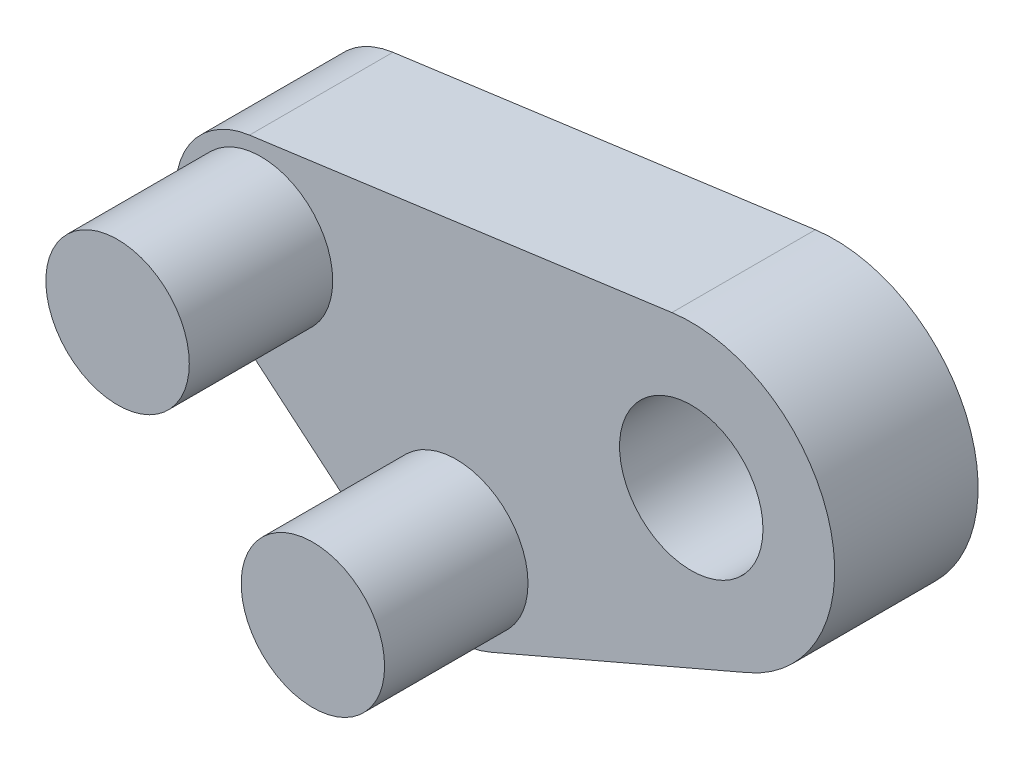
ISO-10303-21;
HEADER;
FILE_DESCRIPTION(('STEP AP214'),'2;1');
FILE_NAME('part.step','',(''),(''),'','','');
FILE_SCHEMA(('AUTOMOTIVE_DESIGN { 1 0 10303 214 1 1 1 1 }'));
ENDSEC;
DATA;
#1=APPLICATION_CONTEXT('core data for automotive mechanical design processes');
#2=APPLICATION_PROTOCOL_DEFINITION('international standard','automotive_design',2000,#1);
#3=PRODUCT_CONTEXT('',#1,'mechanical');
#4=PRODUCT('Part','Part','',(#3));
#5=PRODUCT_RELATED_PRODUCT_CATEGORY('part','',(#4));
#6=PRODUCT_DEFINITION_FORMATION('','',#4);
#7=PRODUCT_DEFINITION_CONTEXT('part definition',#1,'design');
#8=PRODUCT_DEFINITION('design','',#6,#7);
#9=PRODUCT_DEFINITION_SHAPE('','',#8);
#10=(LENGTH_UNIT() NAMED_UNIT(*) SI_UNIT(.MILLI.,.METRE.));
#11=(NAMED_UNIT(*) PLANE_ANGLE_UNIT() SI_UNIT($,.RADIAN.));
#12=(NAMED_UNIT(*) SI_UNIT($,.STERADIAN.) SOLID_ANGLE_UNIT());
#13=UNCERTAINTY_MEASURE_WITH_UNIT(LENGTH_MEASURE(1.E-05),#10,'distance_accuracy_value','');
#14=(GEOMETRIC_REPRESENTATION_CONTEXT(3) GLOBAL_UNCERTAINTY_ASSIGNED_CONTEXT((#13)) GLOBAL_UNIT_ASSIGNED_CONTEXT((#10,
#11,#12)) REPRESENTATION_CONTEXT('',''));
#15=CARTESIAN_POINT('',(0.,0.,0.));
#16=DIRECTION('',(0.,0.,1.));
#17=DIRECTION('',(1.,0.,0.));
#18=AXIS2_PLACEMENT_3D('',#15,#16,#17);
#19=CARTESIAN_POINT('',(0.,0.,-5.));
#20=DIRECTION('',(0.,0.,-1.));
#21=DIRECTION('',(0.,-1.,0.));
#22=AXIS2_PLACEMENT_3D('',#19,#20,#21);
#23=PLANE('',#22);
#24=CARTESIAN_POINT('',(0.,0.,-5.));
#25=DIRECTION('',(0.,0.,1.));
#26=DIRECTION('',(-1.,0.,0.));
#27=AXIS2_PLACEMENT_3D('',#24,#25,#26);
#28=CIRCLE('',#27,2.5);
#29=CARTESIAN_POINT('',(2.5,0.,-5.));
#30=VERTEX_POINT('',#29);
#31=EDGE_CURVE('E27',#30,#30,#28,.T.);
#32=ORIENTED_EDGE('',*,*,#31,.T.);
#33=EDGE_LOOP('',(#32));
#34=FACE_BOUND('',#33,.T.);
#35=DIRECTION('',(0.990857555188311,0.134912213406509,0.));
#36=VECTOR('',#35,1.);
#37=CARTESIAN_POINT('',(-15.4015414871389,2.94910598682629,-5.));
#38=LINE('',#37,#36);
#39=CARTESIAN_POINT('',(-15.4015414871389,2.94910598682629,-5.));
#40=VERTEX_POINT('',#39);
#41=CARTESIAN_POINT('',(-0.674561067032546,4.95428777594155,-5.));
#42=VERTEX_POINT('',#41);
#43=EDGE_CURVE('E134',#40,#42,#38,.T.);
#44=ORIENTED_EDGE('',*,*,#43,.T.);
#45=CARTESIAN_POINT('',(0.,0.,-5.));
#46=DIRECTION('',(0.,0.,-1.));
#47=DIRECTION('',(-0.395938420086769,0.918277064670132,0.));
#48=AXIS2_PLACEMENT_3D('',#45,#46,#47);
#49=CIRCLE('',#48,5.);
#50=CARTESIAN_POINT('',(1.97969210043384,-4.59138532335066,-5.));
#51=VERTEX_POINT('',#50);
#52=EDGE_CURVE('E198',#42,#51,#49,.T.);
#53=ORIENTED_EDGE('',*,*,#52,.T.);
#54=DIRECTION('',(-0.918277064670132,-0.395938420086768,0.));
#55=VECTOR('',#54,1.);
#56=CARTESIAN_POINT('',(1.97969210043384,-4.59138532335066,-5.));
#57=LINE('',#56,#55);
#58=CARTESIAN_POINT('',(-7.01308227185481,-8.46884781713493,-5.));
#59=VERTEX_POINT('',#58);
#60=EDGE_CURVE('E163',#51,#59,#57,.T.);
#61=ORIENTED_EDGE('',*,*,#60,.T.);
#62=CARTESIAN_POINT('',(-8.19152044288992,-5.73576436351047,-5.));
#63=DIRECTION('',(0.,0.,-1.));
#64=DIRECTION('',(0.644287412416517,0.764783453143195,0.));
#65=AXIS2_PLACEMENT_3D('',#62,#63,#64);
#66=CIRCLE('',#65,2.97631679890236);
#67=CARTESIAN_POINT('',(-10.1091238917865,-8.01200220262312,-5.));
#68=VERTEX_POINT('',#67);
#69=EDGE_CURVE('E172',#59,#68,#66,.T.);
#70=ORIENTED_EDGE('',*,*,#69,.T.);
#71=DIRECTION('',(-0.764783453143194,0.644287412416517,0.));
#72=VECTOR('',#71,1.);
#73=CARTESIAN_POINT('',(-10.1091238917865,-8.01200220262312,-5.));
#74=LINE('',#73,#72);
#75=CARTESIAN_POINT('',(-16.9176034488966,-2.27623783911265,-5.));
#76=VERTEX_POINT('',#75);
#77=EDGE_CURVE('E72',#68,#76,#74,.T.);
#78=ORIENTED_EDGE('',*,*,#77,.T.);
#79=CARTESIAN_POINT('',(-15.,0.,-5.));
#80=DIRECTION('',(0.,0.,-1.));
#81=DIRECTION('',(0.134912213406509,-0.990857555188311,0.));
#82=AXIS2_PLACEMENT_3D('',#79,#80,#81);
#83=CIRCLE('',#82,2.97631679890236);
#84=EDGE_CURVE('E148',#76,#40,#83,.T.);
#85=ORIENTED_EDGE('',*,*,#84,.T.);
#86=EDGE_LOOP('',(#44,#53,#61,#70,#78,#85));
#87=FACE_BOUND('',#86,.T.);
#88=ADVANCED_FACE('F16',(#34,#87),#23,.T.);
#89=CARTESIAN_POINT('',(0.,0.,0.));
#90=DIRECTION('',(0.,0.,-1.));
#91=DIRECTION('',(0.,-1.,0.));
#92=AXIS2_PLACEMENT_3D('',#89,#90,#91);
#93=PLANE('',#92);
#94=CARTESIAN_POINT('',(0.,0.,0.));
#95=DIRECTION('',(0.,0.,-1.));
#96=DIRECTION('',(-1.,0.,0.));
#97=AXIS2_PLACEMENT_3D('',#94,#95,#96);
#98=CIRCLE('',#97,2.5);
#99=CARTESIAN_POINT('',(2.5,0.,0.));
#100=VERTEX_POINT('',#99);
#101=EDGE_CURVE('E10',#100,#100,#98,.T.);
#102=ORIENTED_EDGE('',*,*,#101,.T.);
#103=EDGE_LOOP('',(#102));
#104=FACE_BOUND('',#103,.T.);
#105=CARTESIAN_POINT('',(-15.,0.,0.));
#106=DIRECTION('',(0.,0.,-1.));
#107=DIRECTION('',(-1.,0.,0.));
#108=AXIS2_PLACEMENT_3D('',#105,#106,#107);
#109=CIRCLE('',#108,2.5);
#110=CARTESIAN_POINT('',(-12.5,0.,0.));
#111=VERTEX_POINT('',#110);
#112=EDGE_CURVE('E183',#111,#111,#109,.T.);
#113=ORIENTED_EDGE('',*,*,#112,.T.);
#114=EDGE_LOOP('',(#113));
#115=FACE_BOUND('',#114,.T.);
#116=CARTESIAN_POINT('',(-8.19152044288992,-5.73576436351047,0.));
#117=DIRECTION('',(0.,0.,-1.));
#118=DIRECTION('',(-1.,0.,0.));
#119=AXIS2_PLACEMENT_3D('',#116,#117,#118);
#120=CIRCLE('',#119,2.5);
#121=CARTESIAN_POINT('',(-5.69152044288991,-5.73576436351047,0.));
#122=VERTEX_POINT('',#121);
#123=EDGE_CURVE('E107',#122,#122,#120,.T.);
#124=ORIENTED_EDGE('',*,*,#123,.T.);
#125=EDGE_LOOP('',(#124));
#126=FACE_BOUND('',#125,.T.);
#127=DIRECTION('',(-0.990857555188311,-0.134912213406509,0.));
#128=VECTOR('',#127,1.);
#129=CARTESIAN_POINT('',(-0.674561067032546,4.95428777594155,0.));
#130=LINE('',#129,#128);
#131=CARTESIAN_POINT('',(-0.674561067032546,4.95428777594155,0.));
#132=VERTEX_POINT('',#131);
#133=CARTESIAN_POINT('',(-15.4015414871389,2.94910598682629,0.));
#134=VERTEX_POINT('',#133);
#135=EDGE_CURVE('E123',#132,#134,#130,.T.);
#136=ORIENTED_EDGE('',*,*,#135,.T.);
#137=CARTESIAN_POINT('',(-15.,0.,0.));
#138=DIRECTION('',(0.,0.,1.));
#139=DIRECTION('',(0.134912213406509,-0.990857555188311,0.));
#140=AXIS2_PLACEMENT_3D('',#137,#138,#139);
#141=CIRCLE('',#140,2.97631679890236);
#142=CARTESIAN_POINT('',(-16.9176034488966,-2.27623783911265,0.));
#143=VERTEX_POINT('',#142);
#144=EDGE_CURVE('E20',#134,#143,#141,.T.);
#145=ORIENTED_EDGE('',*,*,#144,.T.);
#146=DIRECTION('',(0.764783453143194,-0.644287412416517,0.));
#147=VECTOR('',#146,1.);
#148=CARTESIAN_POINT('',(-16.9176034488966,-2.27623783911265,0.));
#149=LINE('',#148,#147);
#150=CARTESIAN_POINT('',(-10.1091238917865,-8.01200220262312,0.));
#151=VERTEX_POINT('',#150);
#152=EDGE_CURVE('E158',#143,#151,#149,.T.);
#153=ORIENTED_EDGE('',*,*,#152,.T.);
#154=CARTESIAN_POINT('',(-8.19152044288992,-5.73576436351047,0.));
#155=DIRECTION('',(0.,0.,1.));
#156=DIRECTION('',(0.644287412416517,0.764783453143195,0.));
#157=AXIS2_PLACEMENT_3D('',#154,#155,#156);
#158=CIRCLE('',#157,2.97631679890236);
#159=CARTESIAN_POINT('',(-7.01308227185481,-8.46884781713493,0.));
#160=VERTEX_POINT('',#159);
#161=EDGE_CURVE('E167',#151,#160,#158,.T.);
#162=ORIENTED_EDGE('',*,*,#161,.T.);
#163=DIRECTION('',(0.918277064670132,0.395938420086768,0.));
#164=VECTOR('',#163,1.);
#165=CARTESIAN_POINT('',(-7.01308227185481,-8.46884781713493,0.));
#166=LINE('',#165,#164);
#167=CARTESIAN_POINT('',(1.97969210043384,-4.59138532335066,0.));
#168=VERTEX_POINT('',#167);
#169=EDGE_CURVE('E84',#160,#168,#166,.T.);
#170=ORIENTED_EDGE('',*,*,#169,.T.);
#171=CARTESIAN_POINT('',(0.,0.,0.));
#172=DIRECTION('',(0.,0.,1.));
#173=DIRECTION('',(-0.395938420086769,0.918277064670132,0.));
#174=AXIS2_PLACEMENT_3D('',#171,#172,#173);
#175=CIRCLE('',#174,5.);
#176=EDGE_CURVE('E128',#168,#132,#175,.T.);
#177=ORIENTED_EDGE('',*,*,#176,.T.);
#178=EDGE_LOOP('',(#136,#145,#153,#162,#170,#177));
#179=FACE_BOUND('',#178,.T.);
#180=ADVANCED_FACE('F125',(#104,#115,#126,#179),#93,.F.);
#181=CARTESIAN_POINT('',(0.,0.,0.));
#182=DIRECTION('',(0.,0.,-1.));
#183=DIRECTION('',(-1.,0.,0.));
#184=AXIS2_PLACEMENT_3D('',#181,#182,#183);
#185=CYLINDRICAL_SURFACE('',#184,2.5);
#186=ORIENTED_EDGE('',*,*,#101,.F.);
#187=EDGE_LOOP('',(#186));
#188=FACE_BOUND('',#187,.T.);
#189=ORIENTED_EDGE('',*,*,#31,.F.);
#190=EDGE_LOOP('',(#189));
#191=FACE_BOUND('',#190,.T.);
#192=ADVANCED_FACE('F232',(#188,#191),#185,.F.);
#193=CARTESIAN_POINT('',(-15.,0.,5.));
#194=DIRECTION('',(0.,0.,-1.));
#195=DIRECTION('',(0.,-1.,0.));
#196=AXIS2_PLACEMENT_3D('',#193,#194,#195);
#197=PLANE('',#196);
#198=CARTESIAN_POINT('',(-15.,0.,5.));
#199=DIRECTION('',(0.,0.,-1.));
#200=DIRECTION('',(-1.,0.,0.));
#201=AXIS2_PLACEMENT_3D('',#198,#199,#200);
#202=CIRCLE('',#201,2.5);
#203=CARTESIAN_POINT('',(-12.5,0.,5.));
#204=VERTEX_POINT('',#203);
#205=EDGE_CURVE('E213',#204,#204,#202,.T.);
#206=ORIENTED_EDGE('',*,*,#205,.F.);
#207=EDGE_LOOP('',(#206));
#208=FACE_BOUND('',#207,.T.);
#209=ADVANCED_FACE('F18',(#208),#197,.F.);
#210=CARTESIAN_POINT('',(-15.,0.,0.));
#211=DIRECTION('',(0.,0.,1.));
#212=DIRECTION('',(-1.,0.,0.));
#213=AXIS2_PLACEMENT_3D('',#210,#211,#212);
#214=CYLINDRICAL_SURFACE('',#213,2.5);
#215=ORIENTED_EDGE('',*,*,#112,.F.);
#216=EDGE_LOOP('',(#215));
#217=FACE_BOUND('',#216,.T.);
#218=ORIENTED_EDGE('',*,*,#205,.T.);
#219=EDGE_LOOP('',(#218));
#220=FACE_BOUND('',#219,.T.);
#221=ADVANCED_FACE('F224',(#217,#220),#214,.T.);
#222=CARTESIAN_POINT('',(-8.19152044288992,-5.73576436351047,5.));
#223=DIRECTION('',(0.,0.,-1.));
#224=DIRECTION('',(0.,-1.,0.));
#225=AXIS2_PLACEMENT_3D('',#222,#223,#224);
#226=PLANE('',#225);
#227=CARTESIAN_POINT('',(-8.19152044288992,-5.73576436351047,5.));
#228=DIRECTION('',(0.,0.,-1.));
#229=DIRECTION('',(-1.,0.,0.));
#230=AXIS2_PLACEMENT_3D('',#227,#228,#229);
#231=CIRCLE('',#230,2.5);
#232=CARTESIAN_POINT('',(-5.69152044288991,-5.73576436351047,5.));
#233=VERTEX_POINT('',#232);
#234=EDGE_CURVE('E115',#233,#233,#231,.T.);
#235=ORIENTED_EDGE('',*,*,#234,.F.);
#236=EDGE_LOOP('',(#235));
#237=FACE_BOUND('',#236,.T.);
#238=ADVANCED_FACE('F227',(#237),#226,.F.);
#239=CARTESIAN_POINT('',(-8.19152044288992,-5.73576436351047,0.));
#240=DIRECTION('',(0.,0.,1.));
#241=DIRECTION('',(-1.,0.,0.));
#242=AXIS2_PLACEMENT_3D('',#239,#240,#241);
#243=CYLINDRICAL_SURFACE('',#242,2.5);
#244=ORIENTED_EDGE('',*,*,#123,.F.);
#245=EDGE_LOOP('',(#244));
#246=FACE_BOUND('',#245,.T.);
#247=ORIENTED_EDGE('',*,*,#234,.T.);
#248=EDGE_LOOP('',(#247));
#249=FACE_BOUND('',#248,.T.);
#250=ADVANCED_FACE('F252',(#246,#249),#243,.T.);
#251=CARTESIAN_POINT('',(0.,0.,0.));
#252=DIRECTION('',(0.,0.,-1.));
#253=DIRECTION('',(-0.395938420086769,0.918277064670132,0.));
#254=AXIS2_PLACEMENT_3D('',#251,#252,#253);
#255=CYLINDRICAL_SURFACE('',#254,5.);
#256=ORIENTED_EDGE('',*,*,#52,.F.);
#257=DIRECTION('',(0.,0.,-1.));
#258=VECTOR('',#257,1.);
#259=CARTESIAN_POINT('',(-0.674561067032546,4.95428777594155,0.));
#260=LINE('',#259,#258);
#261=EDGE_CURVE('E133',#132,#42,#260,.T.);
#262=ORIENTED_EDGE('',*,*,#261,.F.);
#263=ORIENTED_EDGE('',*,*,#176,.F.);
#264=DIRECTION('',(0.,0.,-1.));
#265=VECTOR('',#264,1.);
#266=CARTESIAN_POINT('',(1.97969210043384,-4.59138532335066,0.));
#267=LINE('',#266,#265);
#268=EDGE_CURVE('E166',#168,#51,#267,.T.);
#269=ORIENTED_EDGE('',*,*,#268,.T.);
#270=EDGE_LOOP('',(#256,#262,#263,#269));
#271=FACE_BOUND('',#270,.T.);
#272=ADVANCED_FACE('F202',(#271),#255,.T.);
#273=CARTESIAN_POINT('',(-7.01308227185481,-8.46884781713493,0.));
#274=DIRECTION('',(0.395938420086768,-0.918277064670132,0.));
#275=DIRECTION('',(0.,0.,-1.));
#276=AXIS2_PLACEMENT_3D('',#273,#274,#275);
#277=PLANE('',#276);
#278=ORIENTED_EDGE('',*,*,#60,.F.);
#279=ORIENTED_EDGE('',*,*,#268,.F.);
#280=ORIENTED_EDGE('',*,*,#169,.F.);
#281=DIRECTION('',(0.,0.,-1.));
#282=VECTOR('',#281,1.);
#283=CARTESIAN_POINT('',(-7.01308227185481,-8.46884781713493,0.));
#284=LINE('',#283,#282);
#285=EDGE_CURVE('E170',#160,#59,#284,.T.);
#286=ORIENTED_EDGE('',*,*,#285,.T.);
#287=EDGE_LOOP('',(#278,#279,#280,#286));
#288=FACE_BOUND('',#287,.T.);
#289=ADVANCED_FACE('F194',(#288),#277,.T.);
#290=CARTESIAN_POINT('',(-0.674561067032546,4.95428777594155,0.));
#291=DIRECTION('',(-0.134912213406509,0.990857555188311,0.));
#292=DIRECTION('',(0.,0.,1.));
#293=AXIS2_PLACEMENT_3D('',#290,#291,#292);
#294=PLANE('',#293);
#295=ORIENTED_EDGE('',*,*,#43,.F.);
#296=DIRECTION('',(0.,0.,-1.));
#297=VECTOR('',#296,1.);
#298=CARTESIAN_POINT('',(-15.4015414871389,2.94910598682629,0.));
#299=LINE('',#298,#297);
#300=EDGE_CURVE('E136',#134,#40,#299,.T.);
#301=ORIENTED_EDGE('',*,*,#300,.F.);
#302=ORIENTED_EDGE('',*,*,#135,.F.);
#303=ORIENTED_EDGE('',*,*,#261,.T.);
#304=EDGE_LOOP('',(#295,#301,#302,#303));
#305=FACE_BOUND('',#304,.T.);
#306=ADVANCED_FACE('F137',(#305),#294,.T.);
#307=CARTESIAN_POINT('',(-15.,0.,0.));
#308=DIRECTION('',(0.,0.,-1.));
#309=DIRECTION('',(0.134912213406509,-0.990857555188311,0.));
#310=AXIS2_PLACEMENT_3D('',#307,#308,#309);
#311=CYLINDRICAL_SURFACE('',#310,2.97631679890236);
#312=ORIENTED_EDGE('',*,*,#84,.F.);
#313=DIRECTION('',(0.,0.,-1.));
#314=VECTOR('',#313,1.);
#315=CARTESIAN_POINT('',(-16.9176034488966,-2.27623783911265,0.));
#316=LINE('',#315,#314);
#317=EDGE_CURVE('E145',#143,#76,#316,.T.);
#318=ORIENTED_EDGE('',*,*,#317,.F.);
#319=ORIENTED_EDGE('',*,*,#144,.F.);
#320=ORIENTED_EDGE('',*,*,#300,.T.);
#321=EDGE_LOOP('',(#312,#318,#319,#320));
#322=FACE_BOUND('',#321,.T.);
#323=ADVANCED_FACE('F144',(#322),#311,.T.);
#324=CARTESIAN_POINT('',(-16.9176034488966,-2.27623783911265,0.));
#325=DIRECTION('',(-0.644287412416517,-0.764783453143194,0.));
#326=DIRECTION('',(-0.764783453143194,0.644287412416517,0.));
#327=AXIS2_PLACEMENT_3D('',#324,#325,#326);
#328=PLANE('',#327);
#329=ORIENTED_EDGE('',*,*,#77,.F.);
#330=DIRECTION('',(0.,0.,-1.));
#331=VECTOR('',#330,1.);
#332=CARTESIAN_POINT('',(-10.1091238917865,-8.01200220262312,0.));
#333=LINE('',#332,#331);
#334=EDGE_CURVE('E169',#151,#68,#333,.T.);
#335=ORIENTED_EDGE('',*,*,#334,.F.);
#336=ORIENTED_EDGE('',*,*,#152,.F.);
#337=ORIENTED_EDGE('',*,*,#317,.T.);
#338=EDGE_LOOP('',(#329,#335,#336,#337));
#339=FACE_BOUND('',#338,.T.);
#340=ADVANCED_FACE('F255',(#339),#328,.T.);
#341=CARTESIAN_POINT('',(-8.19152044288992,-5.73576436351047,0.));
#342=DIRECTION('',(0.,0.,-1.));
#343=DIRECTION('',(0.644287412416517,0.764783453143195,0.));
#344=AXIS2_PLACEMENT_3D('',#341,#342,#343);
#345=CYLINDRICAL_SURFACE('',#344,2.97631679890236);
#346=ORIENTED_EDGE('',*,*,#69,.F.);
#347=ORIENTED_EDGE('',*,*,#285,.F.);
#348=ORIENTED_EDGE('',*,*,#161,.F.);
#349=ORIENTED_EDGE('',*,*,#334,.T.);
#350=EDGE_LOOP('',(#346,#347,#348,#349));
#351=FACE_BOUND('',#350,.T.);
#352=ADVANCED_FACE('F197',(#351),#345,.T.);
#353=CLOSED_SHELL('',(#88,#180,#192,#209,#221,#238,#250,#272,#289,#306,#323,#340,#352));
#354=MANIFOLD_SOLID_BREP('B1',#353);
#355=ADVANCED_BREP_SHAPE_REPRESENTATION('',(#18,#354),#14);
#356=SHAPE_DEFINITION_REPRESENTATION(#9,#355);
ENDSEC;
END-ISO-10303-21;
